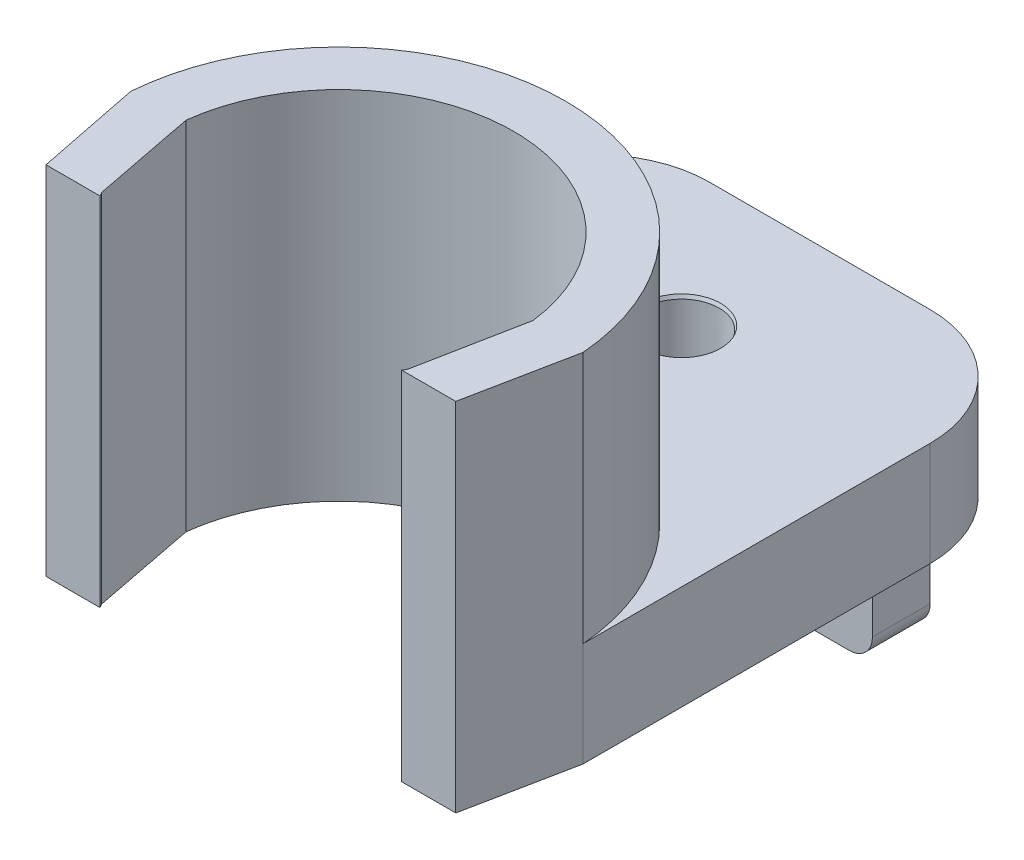
ISO-10303-21;
HEADER;
FILE_DESCRIPTION(('STEP AP214'),'2;1');
FILE_NAME('part.step','',(''),(''),'','','');
FILE_SCHEMA(('AUTOMOTIVE_DESIGN { 1 0 10303 214 1 1 1 1 }'));
ENDSEC;
DATA;
#1=APPLICATION_CONTEXT('core data for automotive mechanical design processes');
#2=APPLICATION_PROTOCOL_DEFINITION('international standard','automotive_design',2000,#1);
#3=PRODUCT_CONTEXT('',#1,'mechanical');
#4=PRODUCT('Part','Part','',(#3));
#5=PRODUCT_RELATED_PRODUCT_CATEGORY('part','',(#4));
#6=PRODUCT_DEFINITION_FORMATION('','',#4);
#7=PRODUCT_DEFINITION_CONTEXT('part definition',#1,'design');
#8=PRODUCT_DEFINITION('design','',#6,#7);
#9=PRODUCT_DEFINITION_SHAPE('','',#8);
#10=(LENGTH_UNIT() NAMED_UNIT(*) SI_UNIT(.MILLI.,.METRE.));
#11=(NAMED_UNIT(*) PLANE_ANGLE_UNIT() SI_UNIT($,.RADIAN.));
#12=(NAMED_UNIT(*) SI_UNIT($,.STERADIAN.) SOLID_ANGLE_UNIT());
#13=UNCERTAINTY_MEASURE_WITH_UNIT(LENGTH_MEASURE(1.E-05),#10,'distance_accuracy_value','');
#14=(GEOMETRIC_REPRESENTATION_CONTEXT(3) GLOBAL_UNCERTAINTY_ASSIGNED_CONTEXT((#13)) GLOBAL_UNIT_ASSIGNED_CONTEXT((#10,
#11,#12)) REPRESENTATION_CONTEXT('',''));
#15=CARTESIAN_POINT('',(0.,0.,0.));
#16=DIRECTION('',(0.,0.,1.));
#17=DIRECTION('',(1.,0.,0.));
#18=AXIS2_PLACEMENT_3D('',#15,#16,#17);
#19=CARTESIAN_POINT('',(0.,318.77,0.));
#20=DIRECTION('',(0.,-1.,0.));
#21=DIRECTION('',(0.,0.,-1.));
#22=AXIS2_PLACEMENT_3D('',#19,#20,#21);
#23=PLANE('',#22);
#24=CARTESIAN_POINT('',(0.,318.77,0.));
#25=DIRECTION('',(0.,-1.,0.));
#26=DIRECTION('',(0.,0.,-1.));
#27=AXIS2_PLACEMENT_3D('',#24,#25,#26);
#28=CIRCLE('',#27,15.095);
#29=CARTESIAN_POINT('',(-13.0345056041586,318.77,7.61319175216006));
#30=VERTEX_POINT('',#29);
#31=CARTESIAN_POINT('',(-13.2274270159691,318.77,7.27283985367548));
#32=VERTEX_POINT('',#31);
#33=EDGE_CURVE('E333',#30,#32,#28,.T.);
#34=ORIENTED_EDGE('',*,*,#33,.F.);
#35=DIRECTION('',(1.,0.,0.));
#36=VECTOR('',#35,1.);
#37=CARTESIAN_POINT('',(0.,318.77,7.61319175216006));
#38=LINE('',#37,#36);
#39=CARTESIAN_POINT('',(-17.7,318.77,7.61319175216006));
#40=VERTEX_POINT('',#39);
#41=EDGE_CURVE('E340',#40,#30,#38,.T.);
#42=ORIENTED_EDGE('',*,*,#41,.F.);
#43=DIRECTION('',(0.1962928408343,0.,0.980545317992595));
#44=VECTOR('',#43,1.);
#45=CARTESIAN_POINT('',(-17.7,318.77,7.61319175216006));
#46=LINE('',#45,#44);
#47=CARTESIAN_POINT('',(-19.5338143213269,318.77,-1.54729540163647));
#48=VERTEX_POINT('',#47);
#49=EDGE_CURVE('E221',#48,#40,#46,.T.);
#50=ORIENTED_EDGE('',*,*,#49,.F.);
#51=DIRECTION('',(0.,0.,-1.));
#52=VECTOR('',#51,1.);
#53=CARTESIAN_POINT('',(-19.5338143213269,318.77,0.));
#54=LINE('',#53,#52);
#55=CARTESIAN_POINT('',(-19.5338143213269,318.77,-31.5472954016365));
#56=VERTEX_POINT('',#55);
#57=EDGE_CURVE('E362',#48,#56,#54,.T.);
#58=ORIENTED_EDGE('',*,*,#57,.T.);
#59=CARTESIAN_POINT('',(-9.53381432132687,318.77,-31.5472954016365));
#60=DIRECTION('',(0.,-1.,0.));
#61=DIRECTION('',(0.,0.,-1.));
#62=AXIS2_PLACEMENT_3D('',#59,#60,#61);
#63=CIRCLE('',#62,10.);
#64=CARTESIAN_POINT('',(-11.7669071606634,318.77,-41.2947718120159));
#65=VERTEX_POINT('',#64);
#66=EDGE_CURVE('E242',#56,#65,#63,.T.);
#67=ORIENTED_EDGE('',*,*,#66,.T.);
#68=DIRECTION('',(0.,0.,1.));
#69=VECTOR('',#68,1.);
#70=CARTESIAN_POINT('',(-11.7669071606634,318.77,-36.5472954016365));
#71=LINE('',#70,#69);
#72=CARTESIAN_POINT('',(-11.7669071606634,318.77,-36.5472954016365));
#73=VERTEX_POINT('',#72);
#74=EDGE_CURVE('E259',#65,#73,#71,.T.);
#75=ORIENTED_EDGE('',*,*,#74,.T.);
#76=DIRECTION('',(-1.,0.,0.));
#77=VECTOR('',#76,1.);
#78=CARTESIAN_POINT('',(0.,318.77,-36.5472954016365));
#79=LINE('',#78,#77);
#80=CARTESIAN_POINT('',(11.5338143213269,318.77,-36.5472954016365));
#81=VERTEX_POINT('',#80);
#82=EDGE_CURVE('E392',#81,#73,#79,.T.);
#83=ORIENTED_EDGE('',*,*,#82,.F.);
#84=DIRECTION('',(0.,0.,1.));
#85=VECTOR('',#84,1.);
#86=CARTESIAN_POINT('',(11.5338143213269,318.77,0.));
#87=LINE('',#86,#85);
#88=CARTESIAN_POINT('',(11.5338143213269,318.77,-41.3452543727692));
#89=VERTEX_POINT('',#88);
#90=EDGE_CURVE('E262',#81,#89,#87,.F.);
#91=ORIENTED_EDGE('',*,*,#90,.T.);
#92=CARTESIAN_POINT('',(9.53381432132687,318.77,-31.5472954016365));
#93=DIRECTION('',(0.,-1.,0.));
#94=DIRECTION('',(0.,0.,-1.));
#95=AXIS2_PLACEMENT_3D('',#92,#93,#94);
#96=CIRCLE('',#95,10.);
#97=CARTESIAN_POINT('',(19.5338143213269,318.77,-31.5472954016365));
#98=VERTEX_POINT('',#97);
#99=EDGE_CURVE('E226',#89,#98,#96,.T.);
#100=ORIENTED_EDGE('',*,*,#99,.T.);
#101=DIRECTION('',(0.,0.,-1.));
#102=VECTOR('',#101,1.);
#103=CARTESIAN_POINT('',(19.5338143213269,318.77,0.));
#104=LINE('',#103,#102);
#105=CARTESIAN_POINT('',(19.5338143213269,318.77,-1.54729540163646));
#106=VERTEX_POINT('',#105);
#107=EDGE_CURVE('E347',#106,#98,#104,.T.);
#108=ORIENTED_EDGE('',*,*,#107,.F.);
#109=DIRECTION('',(0.1962928408343,0.,-0.980545317992596));
#110=VECTOR('',#109,1.);
#111=CARTESIAN_POINT('',(19.5338143213269,318.77,-1.54729540163646));
#112=LINE('',#111,#110);
#113=CARTESIAN_POINT('',(17.7,318.77,7.61319175216007));
#114=VERTEX_POINT('',#113);
#115=EDGE_CURVE('E339',#114,#106,#112,.T.);
#116=ORIENTED_EDGE('',*,*,#115,.F.);
#117=CARTESIAN_POINT('',(13.0345056041586,318.77,7.61319175216007));
#118=VERTEX_POINT('',#117);
#119=EDGE_CURVE('E322',#118,#114,#38,.T.);
#120=ORIENTED_EDGE('',*,*,#119,.F.);
#121=CARTESIAN_POINT('',(0.,318.77,0.));
#122=DIRECTION('',(0.,-1.,0.));
#123=DIRECTION('',(0.,0.,-1.));
#124=AXIS2_PLACEMENT_3D('',#121,#122,#123);
#125=CIRCLE('',#124,15.095);
#126=CARTESIAN_POINT('',(13.2274270159691,318.77,7.27283985367547));
#127=VERTEX_POINT('',#126);
#128=EDGE_CURVE('E327',#127,#118,#125,.T.);
#129=ORIENTED_EDGE('',*,*,#128,.F.);
#130=DIRECTION('',(0.191180053095286,0.,-0.981554984348041));
#131=VECTOR('',#130,1.);
#132=CARTESIAN_POINT('',(14.1087425915103,318.77,2.74799700553123));
#133=LINE('',#132,#131);
#134=CARTESIAN_POINT('',(14.9900581670516,318.77,-1.77684584261301));
#135=VERTEX_POINT('',#134);
#136=EDGE_CURVE('E332',#127,#135,#133,.T.);
#137=ORIENTED_EDGE('',*,*,#136,.T.);
#138=CARTESIAN_POINT('',(0.,318.77,0.));
#139=DIRECTION('',(0.,-1.,0.));
#140=DIRECTION('',(0.,0.,-1.));
#141=AXIS2_PLACEMENT_3D('',#138,#139,#140);
#142=CIRCLE('',#141,15.095);
#143=CARTESIAN_POINT('',(-14.9900581670516,318.77,-1.77684584261301));
#144=VERTEX_POINT('',#143);
#145=EDGE_CURVE('E401',#144,#135,#142,.T.);
#146=ORIENTED_EDGE('',*,*,#145,.F.);
#147=DIRECTION('',(-0.191180053095286,0.,-0.981554984348041));
#148=VECTOR('',#147,1.);
#149=CARTESIAN_POINT('',(-14.1087425915103,318.77,2.74799700553123));
#150=LINE('',#149,#148);
#151=EDGE_CURVE('E395',#32,#144,#150,.T.);
#152=ORIENTED_EDGE('',*,*,#151,.F.);
#153=EDGE_LOOP('',(#34,#42,#50,#58,#67,#75,#83,#91,#100,#108,#116,#120,#129,#137,#146,#152));
#154=FACE_BOUND('',#153,.T.);
#155=CARTESIAN_POINT('',(0.,318.77,-29.595));
#156=DIRECTION('',(0.,-1.,0.));
#157=DIRECTION('',(0.,0.,-1.));
#158=AXIS2_PLACEMENT_3D('',#155,#156,#157);
#159=CIRCLE('',#158,3.25);
#160=CARTESIAN_POINT('',(0.,318.77,-32.845));
#161=VERTEX_POINT('',#160);
#162=EDGE_CURVE('E367',#161,#161,#159,.T.);
#163=ORIENTED_EDGE('',*,*,#162,.F.);
#164=EDGE_LOOP('',(#163));
#165=FACE_BOUND('',#164,.T.);
#166=ADVANCED_FACE('F45',(#154,#165),#23,.T.);
#167=CARTESIAN_POINT('',(0.,318.77,0.));
#168=DIRECTION('',(0.,1.,0.));
#169=DIRECTION('',(0.,0.,1.));
#170=AXIS2_PLACEMENT_3D('',#167,#168,#169);
#171=CYLINDRICAL_SURFACE('',#170,19.595);
#172=CARTESIAN_POINT('',(0.,349.57,0.));
#173=DIRECTION('',(0.,-1.,0.));
#174=DIRECTION('',(0.,0.,-1.));
#175=AXIS2_PLACEMENT_3D('',#172,#173,#174);
#176=CIRCLE('',#175,19.595);
#177=CARTESIAN_POINT('',(19.5338143213269,349.57,-1.54729540163646));
#178=VERTEX_POINT('',#177);
#179=CARTESIAN_POINT('',(-19.5338143213269,349.57,-1.54729540163647));
#180=VERTEX_POINT('',#179);
#181=EDGE_CURVE('E202',#178,#180,#176,.F.);
#182=ORIENTED_EDGE('',*,*,#181,.F.);
#183=DIRECTION('',(0.,1.,0.));
#184=VECTOR('',#183,1.);
#185=CARTESIAN_POINT('',(19.5338143213269,318.77,-1.54729540163646));
#186=LINE('',#185,#184);
#187=CARTESIAN_POINT('',(19.5338143213269,327.77,-1.54729540163646));
#188=VERTEX_POINT('',#187);
#189=EDGE_CURVE('E237',#188,#178,#186,.T.);
#190=ORIENTED_EDGE('',*,*,#189,.F.);
#191=CARTESIAN_POINT('',(0.,327.77,0.));
#192=DIRECTION('',(0.,-1.,0.));
#193=DIRECTION('',(0.,0.,-1.));
#194=AXIS2_PLACEMENT_3D('',#191,#192,#193);
#195=CIRCLE('',#194,19.595);
#196=CARTESIAN_POINT('',(-19.5338143213269,327.77,-1.54729540163647));
#197=VERTEX_POINT('',#196);
#198=EDGE_CURVE('E341',#197,#188,#195,.T.);
#199=ORIENTED_EDGE('',*,*,#198,.F.);
#200=DIRECTION('',(0.,1.,0.));
#201=VECTOR('',#200,1.);
#202=CARTESIAN_POINT('',(-19.5338143213269,318.77,-1.54729540163647));
#203=LINE('',#202,#201);
#204=EDGE_CURVE('E229',#197,#180,#203,.T.);
#205=ORIENTED_EDGE('',*,*,#204,.T.);
#206=EDGE_LOOP('',(#182,#190,#199,#205));
#207=FACE_BOUND('',#206,.T.);
#208=ADVANCED_FACE('F427',(#207),#171,.T.);
#209=CARTESIAN_POINT('',(-17.7,318.77,7.61319175216006));
#210=DIRECTION('',(-0.980545317992595,0.,0.1962928408343));
#211=DIRECTION('',(0.1962928408343,0.,0.980545317992595));
#212=AXIS2_PLACEMENT_3D('',#209,#210,#211);
#213=PLANE('',#212);
#214=DIRECTION('',(0.1962928408343,0.,0.980545317992595));
#215=VECTOR('',#214,1.);
#216=CARTESIAN_POINT('',(-17.7,349.57,7.61319175216006));
#217=LINE('',#216,#215);
#218=CARTESIAN_POINT('',(-17.7,349.57,7.61319175216006));
#219=VERTEX_POINT('',#218);
#220=EDGE_CURVE('E196',#180,#219,#217,.T.);
#221=ORIENTED_EDGE('',*,*,#220,.F.);
#222=ORIENTED_EDGE('',*,*,#204,.F.);
#223=EDGE_CURVE('E223',#48,#197,#203,.T.);
#224=ORIENTED_EDGE('',*,*,#223,.F.);
#225=ORIENTED_EDGE('',*,*,#49,.T.);
#226=DIRECTION('',(0.,1.,0.));
#227=VECTOR('',#226,1.);
#228=CARTESIAN_POINT('',(-17.7,318.77,7.61319175216006));
#229=LINE('',#228,#227);
#230=EDGE_CURVE('E213',#40,#219,#229,.T.);
#231=ORIENTED_EDGE('',*,*,#230,.T.);
#232=EDGE_LOOP('',(#221,#222,#224,#225,#231));
#233=FACE_BOUND('',#232,.T.);
#234=ADVANCED_FACE('F219',(#233),#213,.T.);
#235=CARTESIAN_POINT('',(19.5338143213269,318.77,-1.54729540163646));
#236=DIRECTION('',(0.980545317992595,0.,0.1962928408343));
#237=DIRECTION('',(0.1962928408343,0.,-0.980545317992595));
#238=AXIS2_PLACEMENT_3D('',#235,#236,#237);
#239=PLANE('',#238);
#240=DIRECTION('',(0.1962928408343,0.,-0.980545317992595));
#241=VECTOR('',#240,1.);
#242=CARTESIAN_POINT('',(19.5338143213269,349.57,-1.54729540163646));
#243=LINE('',#242,#241);
#244=CARTESIAN_POINT('',(17.7,349.57,7.61319175216006));
#245=VERTEX_POINT('',#244);
#246=EDGE_CURVE('E416',#245,#178,#243,.T.);
#247=ORIENTED_EDGE('',*,*,#246,.F.);
#248=DIRECTION('',(0.,1.,0.));
#249=VECTOR('',#248,1.);
#250=CARTESIAN_POINT('',(17.7,318.77,7.61319175216007));
#251=LINE('',#250,#249);
#252=EDGE_CURVE('E238',#114,#245,#251,.T.);
#253=ORIENTED_EDGE('',*,*,#252,.F.);
#254=ORIENTED_EDGE('',*,*,#115,.T.);
#255=EDGE_CURVE('E234',#106,#188,#186,.T.);
#256=ORIENTED_EDGE('',*,*,#255,.T.);
#257=ORIENTED_EDGE('',*,*,#189,.T.);
#258=EDGE_LOOP('',(#247,#253,#254,#256,#257));
#259=FACE_BOUND('',#258,.T.);
#260=ADVANCED_FACE('F352',(#259),#239,.T.);
#261=CARTESIAN_POINT('',(-17.7,309.57,7.61319175216006));
#262=DIRECTION('',(0.,0.,-1.));
#263=DIRECTION('',(-1.,0.,0.));
#264=AXIS2_PLACEMENT_3D('',#261,#262,#263);
#265=PLANE('',#264);
#266=ORIENTED_EDGE('',*,*,#252,.T.);
#267=DIRECTION('',(1.,0.,0.));
#268=VECTOR('',#267,1.);
#269=CARTESIAN_POINT('',(25.,349.57,7.61319175216006));
#270=LINE('',#269,#268);
#271=CARTESIAN_POINT('',(13.0345056041586,349.57,7.61319175216006));
#272=VERTEX_POINT('',#271);
#273=EDGE_CURVE('E216',#272,#245,#270,.T.);
#274=ORIENTED_EDGE('',*,*,#273,.F.);
#275=DIRECTION('',(0.,1.,0.));
#276=VECTOR('',#275,1.);
#277=CARTESIAN_POINT('',(13.0345056041586,299.57,7.61319175216007));
#278=LINE('',#277,#276);
#279=EDGE_CURVE('E53',#272,#118,#278,.F.);
#280=ORIENTED_EDGE('',*,*,#279,.T.);
#281=ORIENTED_EDGE('',*,*,#119,.T.);
#282=EDGE_LOOP('',(#266,#274,#280,#281));
#283=FACE_BOUND('',#282,.T.);
#284=ADVANCED_FACE('F320',(#283),#265,.F.);
#285=DIRECTION('',(0.,1.,0.));
#286=VECTOR('',#285,1.);
#287=CARTESIAN_POINT('',(-13.0345056041586,299.57,7.61319175216006));
#288=LINE('',#287,#286);
#289=CARTESIAN_POINT('',(-13.0345056041586,349.57,7.61319175216006));
#290=VERTEX_POINT('',#289);
#291=EDGE_CURVE('E215',#30,#290,#288,.T.);
#292=ORIENTED_EDGE('',*,*,#291,.T.);
#293=EDGE_CURVE('E199',#219,#290,#270,.T.);
#294=ORIENTED_EDGE('',*,*,#293,.F.);
#295=ORIENTED_EDGE('',*,*,#230,.F.);
#296=ORIENTED_EDGE('',*,*,#41,.T.);
#297=EDGE_LOOP('',(#292,#294,#295,#296));
#298=FACE_BOUND('',#297,.T.);
#299=ADVANCED_FACE('F211',(#298),#265,.F.);
#300=CARTESIAN_POINT('',(-19.5338143213269,327.77,0.));
#301=DIRECTION('',(-1.,0.,0.));
#302=DIRECTION('',(0.,0.,1.));
#303=AXIS2_PLACEMENT_3D('',#300,#301,#302);
#304=PLANE('',#303);
#305=DIRECTION('',(0.,0.,-1.));
#306=VECTOR('',#305,1.);
#307=CARTESIAN_POINT('',(-19.5338143213269,327.77,0.));
#308=LINE('',#307,#306);
#309=CARTESIAN_POINT('',(-19.5338143213269,327.77,-31.5472954016365));
#310=VERTEX_POINT('',#309);
#311=EDGE_CURVE('E361',#197,#310,#308,.T.);
#312=ORIENTED_EDGE('',*,*,#311,.T.);
#313=DIRECTION('',(0.,-1.,0.));
#314=VECTOR('',#313,1.);
#315=CARTESIAN_POINT('',(-19.5338143213269,327.77,-31.5472954016365));
#316=LINE('',#315,#314);
#317=EDGE_CURVE('E222',#310,#56,#316,.T.);
#318=ORIENTED_EDGE('',*,*,#317,.T.);
#319=ORIENTED_EDGE('',*,*,#57,.F.);
#320=ORIENTED_EDGE('',*,*,#223,.T.);
#321=EDGE_LOOP('',(#312,#318,#319,#320));
#322=FACE_BOUND('',#321,.T.);
#323=ADVANCED_FACE('F430',(#322),#304,.T.);
#324=CARTESIAN_POINT('',(19.5338143213269,327.77,0.));
#325=DIRECTION('',(-1.,0.,0.));
#326=DIRECTION('',(0.,0.,1.));
#327=AXIS2_PLACEMENT_3D('',#324,#325,#326);
#328=PLANE('',#327);
#329=ORIENTED_EDGE('',*,*,#107,.T.);
#330=DIRECTION('',(0.,-1.,0.));
#331=VECTOR('',#330,1.);
#332=CARTESIAN_POINT('',(19.5338143213269,327.77,-31.5472954016365));
#333=LINE('',#332,#331);
#334=CARTESIAN_POINT('',(19.5338143213269,327.77,-31.5472954016365));
#335=VERTEX_POINT('',#334);
#336=EDGE_CURVE('E252',#98,#335,#333,.F.);
#337=ORIENTED_EDGE('',*,*,#336,.T.);
#338=DIRECTION('',(0.,0.,-1.));
#339=VECTOR('',#338,1.);
#340=CARTESIAN_POINT('',(19.5338143213269,327.77,0.));
#341=LINE('',#340,#339);
#342=EDGE_CURVE('E344',#188,#335,#341,.T.);
#343=ORIENTED_EDGE('',*,*,#342,.F.);
#344=ORIENTED_EDGE('',*,*,#255,.F.);
#345=EDGE_LOOP('',(#329,#337,#343,#344));
#346=FACE_BOUND('',#345,.T.);
#347=ADVANCED_FACE('F357',(#346),#328,.F.);
#348=CARTESIAN_POINT('',(0.,327.77,-41.5472954016365));
#349=DIRECTION('',(0.,0.,-1.));
#350=DIRECTION('',(-1.,0.,0.));
#351=AXIS2_PLACEMENT_3D('',#348,#349,#350);
#352=PLANE('',#351);
#353=DIRECTION('',(1.,0.,0.));
#354=VECTOR('',#353,1.);
#355=CARTESIAN_POINT('',(0.,303.77,-41.5472954016365));
#356=LINE('',#355,#354);
#357=CARTESIAN_POINT('',(-7.76690716066343,303.77,-41.5472954016365));
#358=VERTEX_POINT('',#357);
#359=CARTESIAN_POINT('',(7.53381432132687,303.77,-41.5472954016365));
#360=VERTEX_POINT('',#359);
#361=EDGE_CURVE('E394',#358,#360,#356,.T.);
#362=ORIENTED_EDGE('',*,*,#361,.F.);
#363=CARTESIAN_POINT('',(-7.76690716066343,305.77,-41.5472954016365));
#364=DIRECTION('',(0.,0.,-1.));
#365=DIRECTION('',(-1.,0.,0.));
#366=AXIS2_PLACEMENT_3D('',#363,#364,#365);
#367=CIRCLE('',#366,2.);
#368=CARTESIAN_POINT('',(-9.53381432132687,304.832962601816,-41.5472954016365));
#369=VERTEX_POINT('',#368);
#370=EDGE_CURVE('E280',#358,#369,#367,.T.);
#371=ORIENTED_EDGE('',*,*,#370,.T.);
#372=DIRECTION('',(0.,-1.,0.));
#373=VECTOR('',#372,1.);
#374=CARTESIAN_POINT('',(-9.53381432132687,327.77,-41.5472954016365));
#375=LINE('',#374,#373);
#376=CARTESIAN_POINT('',(-9.53381432132687,327.77,-41.5472954016365));
#377=VERTEX_POINT('',#376);
#378=EDGE_CURVE('E246',#369,#377,#375,.F.);
#379=ORIENTED_EDGE('',*,*,#378,.T.);
#380=DIRECTION('',(1.,0.,0.));
#381=VECTOR('',#380,1.);
#382=CARTESIAN_POINT('',(0.,327.77,-41.5472954016365));
#383=LINE('',#382,#381);
#384=CARTESIAN_POINT('',(9.53381432132687,327.77,-41.5472954016365));
#385=VERTEX_POINT('',#384);
#386=EDGE_CURVE('E364',#377,#385,#383,.T.);
#387=ORIENTED_EDGE('',*,*,#386,.T.);
#388=DIRECTION('',(0.,-1.,0.));
#389=VECTOR('',#388,1.);
#390=CARTESIAN_POINT('',(9.53381432132687,318.77,-41.5472954016365));
#391=LINE('',#390,#389);
#392=CARTESIAN_POINT('',(9.53381432132687,316.77,-41.5472954016365));
#393=VERTEX_POINT('',#392);
#394=EDGE_CURVE('E67',#385,#393,#391,.T.);
#395=ORIENTED_EDGE('',*,*,#394,.T.);
#396=DIRECTION('',(0.,1.,0.));
#397=VECTOR('',#396,1.);
#398=CARTESIAN_POINT('',(9.53381432132687,303.77,-41.5472954016365));
#399=LINE('',#398,#397);
#400=CARTESIAN_POINT('',(9.53381432132687,305.77,-41.5472954016365));
#401=VERTEX_POINT('',#400);
#402=EDGE_CURVE('E380',#401,#393,#399,.T.);
#403=ORIENTED_EDGE('',*,*,#402,.F.);
#404=CARTESIAN_POINT('',(7.53381432132687,305.77,-41.5472954016365));
#405=DIRECTION('',(0.,0.,-1.));
#406=DIRECTION('',(-1.,0.,0.));
#407=AXIS2_PLACEMENT_3D('',#404,#405,#406);
#408=CIRCLE('',#407,2.);
#409=EDGE_CURVE('E278',#401,#360,#408,.T.);
#410=ORIENTED_EDGE('',*,*,#409,.T.);
#411=EDGE_LOOP('',(#362,#371,#379,#387,#395,#403,#410));
#412=FACE_BOUND('',#411,.T.);
#413=ADVANCED_FACE('F494',(#412),#352,.T.);
#414=CARTESIAN_POINT('',(0.,327.77,0.));
#415=DIRECTION('',(0.,-1.,0.));
#416=DIRECTION('',(0.,0.,-1.));
#417=AXIS2_PLACEMENT_3D('',#414,#415,#416);
#418=PLANE('',#417);
#419=CARTESIAN_POINT('',(0.,327.77,-29.595));
#420=DIRECTION('',(0.,1.,0.));
#421=DIRECTION('',(0.,0.,1.));
#422=AXIS2_PLACEMENT_3D('',#419,#420,#421);
#423=CIRCLE('',#422,3.375);
#424=CARTESIAN_POINT('',(0.,327.77,-26.22));
#425=VERTEX_POINT('',#424);
#426=EDGE_CURVE('E377',#425,#425,#423,.T.);
#427=ORIENTED_EDGE('',*,*,#426,.F.);
#428=EDGE_LOOP('',(#427));
#429=FACE_BOUND('',#428,.T.);
#430=ORIENTED_EDGE('',*,*,#386,.F.);
#431=CARTESIAN_POINT('',(-9.53381432132687,327.77,-31.5472954016365));
#432=DIRECTION('',(0.,-1.,0.));
#433=DIRECTION('',(0.,0.,-1.));
#434=AXIS2_PLACEMENT_3D('',#431,#432,#433);
#435=CIRCLE('',#434,10.);
#436=EDGE_CURVE('E250',#377,#310,#435,.F.);
#437=ORIENTED_EDGE('',*,*,#436,.T.);
#438=ORIENTED_EDGE('',*,*,#311,.F.);
#439=ORIENTED_EDGE('',*,*,#198,.T.);
#440=ORIENTED_EDGE('',*,*,#342,.T.);
#441=CARTESIAN_POINT('',(9.53381432132687,327.77,-31.5472954016365));
#442=DIRECTION('',(0.,-1.,0.));
#443=DIRECTION('',(0.,0.,-1.));
#444=AXIS2_PLACEMENT_3D('',#441,#442,#443);
#445=CIRCLE('',#444,10.);
#446=EDGE_CURVE('E248',#335,#385,#445,.F.);
#447=ORIENTED_EDGE('',*,*,#446,.T.);
#448=EDGE_LOOP('',(#430,#437,#438,#439,#440,#447));
#449=FACE_BOUND('',#448,.T.);
#450=ADVANCED_FACE('F434',(#429,#449),#418,.F.);
#451=CARTESIAN_POINT('',(0.,327.77,-29.595));
#452=DIRECTION('',(0.,1.,0.));
#453=DIRECTION('',(0.,0.,1.));
#454=AXIS2_PLACEMENT_3D('',#451,#452,#453);
#455=CYLINDRICAL_SURFACE('',#454,3.25);
#456=CARTESIAN_POINT('',(0.,327.468223304703,-29.595));
#457=DIRECTION('',(0.,1.,0.));
#458=DIRECTION('',(0.,0.,1.));
#459=AXIS2_PLACEMENT_3D('',#456,#457,#458);
#460=CIRCLE('',#459,3.25);
#461=CARTESIAN_POINT('',(0.,327.468223304703,-26.345));
#462=VERTEX_POINT('',#461);
#463=EDGE_CURVE('E370',#462,#462,#460,.T.);
#464=ORIENTED_EDGE('',*,*,#463,.T.);
#465=EDGE_LOOP('',(#464));
#466=FACE_BOUND('',#465,.T.);
#467=ORIENTED_EDGE('',*,*,#162,.T.);
#468=EDGE_LOOP('',(#467));
#469=FACE_BOUND('',#468,.T.);
#470=ADVANCED_FACE('F501',(#466,#469),#455,.F.);
#471=CARTESIAN_POINT('',(0.,327.77,-29.595));
#472=DIRECTION('',(0.,1.,0.));
#473=DIRECTION('',(0.,0.,1.));
#474=AXIS2_PLACEMENT_3D('',#471,#472,#473);
#475=CONICAL_SURFACE('',#474,3.375,0.392699081698733);
#476=ORIENTED_EDGE('',*,*,#463,.F.);
#477=EDGE_LOOP('',(#476));
#478=FACE_BOUND('',#477,.T.);
#479=ORIENTED_EDGE('',*,*,#426,.T.);
#480=EDGE_LOOP('',(#479));
#481=FACE_BOUND('',#480,.T.);
#482=ADVANCED_FACE('F466',(#478,#481),#475,.F.);
#483=CARTESIAN_POINT('',(-9.53381432132687,327.77,-31.5472954016365));
#484=DIRECTION('',(0.,-1.,0.));
#485=DIRECTION('',(0.,0.,-1.));
#486=AXIS2_PLACEMENT_3D('',#483,#484,#485);
#487=CYLINDRICAL_SURFACE('',#486,10.);
#488=ORIENTED_EDGE('',*,*,#378,.F.);
#489=CARTESIAN_POINT('',(-9.53381432132687,304.832962601816,-41.5472954016365));
#490=CARTESIAN_POINT('',(-9.56042551823967,304.883127858395,-41.5472929579181));
#491=CARTESIAN_POINT('',(-9.58488880831034,304.93443173061,-41.5471890358423));
#492=CARTESIAN_POINT('',(-9.62937571490766,305.038952073037,-41.5468642086717));
#493=CARTESIAN_POINT('',(-9.64939766627155,305.092169251931,-41.5466432598056));
#494=CARTESIAN_POINT('',(-9.68448222218,305.199030160799,-41.5461752280064));
#495=CARTESIAN_POINT('',(-9.69963630092735,305.252643890637,-41.5459287586258));
#496=CARTESIAN_POINT('',(-9.72541463847834,305.360923390073,-41.5454680221845));
#497=CARTESIAN_POINT('',(-9.73604113153452,305.415588626826,-41.5452537392744));
#498=CARTESIAN_POINT('',(-9.7518340593349,305.519898255309,-41.5449214017015));
#499=CARTESIAN_POINT('',(-9.75745282124989,305.569474691895,-41.5447956662496));
#500=CARTESIAN_POINT('',(-9.76500820880981,305.669364709529,-41.5446226505739));
#501=CARTESIAN_POINT('',(-9.76691060753065,305.719680881851,-41.5445761001282));
#502=CARTESIAN_POINT('',(-9.76690716066343,305.77,-41.5445784189492));
#503=B_SPLINE_CURVE_WITH_KNOTS('',3,(#489,#490,#491,#492,#493,#494,#495,#496,#497,#498,#499,
#500,#501,#502),.UNSPECIFIED.,.F.,.F.,(4,2,2,2,2,2,4),(0.,0.17030758531962,0.340678915456088,
0.507630685866859,0.67449997398182,0.824044761607944,0.974960450579539),.UNSPECIFIED.);
#504=CARTESIAN_POINT('',(-9.76690716066343,305.77,-41.5445784189492));
#505=VERTEX_POINT('',#504);
#506=EDGE_CURVE('E282',#369,#505,#503,.T.);
#507=ORIENTED_EDGE('',*,*,#506,.T.);
#508=DIRECTION('',(0.,1.,0.));
#509=VECTOR('',#508,1.);
#510=CARTESIAN_POINT('',(-9.76690716066343,303.77,-41.5445784189492));
#511=LINE('',#510,#509);
#512=CARTESIAN_POINT('',(-9.76690716066343,316.77,-41.5445784189492));
#513=VERTEX_POINT('',#512);
#514=EDGE_CURVE('E388',#505,#513,#511,.T.);
#515=ORIENTED_EDGE('',*,*,#514,.T.);
#516=CARTESIAN_POINT('',(-9.76690716066343,316.77,-41.5445784189492));
#517=CARTESIAN_POINT('',(-9.76690753704446,316.826207739626,-41.5445756845839));
#518=CARTESIAN_POINT('',(-9.76927813398007,316.882388584646,-41.5445234453085));
#519=CARTESIAN_POINT('',(-9.77873542948893,316.994349174416,-41.5442972839632));
#520=CARTESIAN_POINT('',(-9.78582192675048,317.050128936186,-41.5441233670875));
#521=CARTESIAN_POINT('',(-9.81408985175402,317.216181267396,-41.5433858505241));
#522=CARTESIAN_POINT('',(-9.84227988652494,317.325343108553,-41.5426066161938));
#523=CARTESIAN_POINT('',(-9.91656533818463,317.537384505502,-41.5400361086555));
#524=CARTESIAN_POINT('',(-9.96267005721857,317.640260765355,-41.5382443094562));
#525=CARTESIAN_POINT('',(-10.0714539948191,317.836790607899,-41.5329800097009));
#526=CARTESIAN_POINT('',(-10.1341301417357,317.93044589536,-41.5295078205199));
#527=CARTESIAN_POINT('',(-10.2740710008998,318.10565953209,-41.5201040416591));
#528=CARTESIAN_POINT('',(-10.3513038067362,318.187243654581,-41.5141777975837));
#529=CARTESIAN_POINT('',(-10.5181460559143,318.336237873972,-41.4990836513585));
#530=CARTESIAN_POINT('',(-10.6077557104427,318.403647728966,-41.4899156938909));
#531=CARTESIAN_POINT('',(-10.7960180339919,318.52204681628,-41.4677671779222));
#532=CARTESIAN_POINT('',(-10.8946115083521,318.573134779067,-41.4548104875107));
#533=CARTESIAN_POINT('',(-11.0983312884642,318.658167829971,-41.424687117531));
#534=CARTESIAN_POINT('',(-11.2034560700129,318.69211690102,-41.4075214174794));
#535=CARTESIAN_POINT('',(-11.3854423043819,318.734806621094,-41.374671608599));
#536=CARTESIAN_POINT('',(-11.4614798266458,318.748031342914,-41.3600476361846));
#537=CARTESIAN_POINT('',(-11.6140460428911,318.765628390394,-41.3288474314818));
#538=CARTESIAN_POINT('',(-11.6905737238264,318.77001523425,-41.3122744483695));
#539=CARTESIAN_POINT('',(-11.7669071606634,318.77,-41.2947718120159));
#540=B_SPLINE_CURVE_WITH_KNOTS('',3,(#516,#517,#518,#519,#520,#521,#522,#523,#524,#525,#526,
#527,#528,#529,#530,#531,#532,#533,#534,#535,#536,#537,#538,#539),.UNSPECIFIED.,.F.,.F.,(4,2,2,
2,2,2,2,2,2,2,2,4),(0.,0.168519779912596,0.337032366537702,0.673535581435803,1.01021375859866,
1.34682957339999,1.68271597186344,2.01860810227597,2.35242817805012,2.6861706411447,
2.92132945145261,3.15610164466803),.UNSPECIFIED.);
#541=EDGE_CURVE('E308',#513,#65,#540,.T.);
#542=ORIENTED_EDGE('',*,*,#541,.T.);
#543=ORIENTED_EDGE('',*,*,#66,.F.);
#544=ORIENTED_EDGE('',*,*,#317,.F.);
#545=ORIENTED_EDGE('',*,*,#436,.F.);
#546=EDGE_LOOP('',(#488,#507,#515,#542,#543,#544,#545));
#547=FACE_BOUND('',#546,.T.);
#548=ADVANCED_FACE('F291',(#547),#487,.T.);
#549=CARTESIAN_POINT('',(9.53381432132687,327.77,-31.5472954016365));
#550=DIRECTION('',(0.,1.,0.));
#551=DIRECTION('',(0.,0.,1.));
#552=AXIS2_PLACEMENT_3D('',#549,#550,#551);
#553=CYLINDRICAL_SURFACE('',#552,10.);
#554=ORIENTED_EDGE('',*,*,#446,.F.);
#555=ORIENTED_EDGE('',*,*,#336,.F.);
#556=ORIENTED_EDGE('',*,*,#99,.F.);
#557=CARTESIAN_POINT('',(11.5338143213269,318.77,-41.3452543727692));
#558=CARTESIAN_POINT('',(11.4787869564066,318.769999653392,-41.356489283858));
#559=CARTESIAN_POINT('',(11.4236869996809,318.767727307437,-41.3672504964301));
#560=CARTESIAN_POINT('',(11.3136769215847,318.758615027905,-41.3877839179117));
#561=CARTESIAN_POINT('',(11.2587668156482,318.751774731362,-41.3975560481587));
#562=CARTESIAN_POINT('',(11.0949878980105,318.724392284707,-41.425298274568));
#563=CARTESIAN_POINT('',(10.9869167039702,318.696988688377,-41.441725452414));
#564=CARTESIAN_POINT('',(10.7762752920647,318.624339793128,-41.4703812974654));
#565=CARTESIAN_POINT('',(10.6737112882155,318.579074801807,-41.4826053026912));
#566=CARTESIAN_POINT('',(10.4773180747201,318.471857725121,-41.5031755463527));
#567=CARTESIAN_POINT('',(10.3834855440694,318.40991201944,-41.5115232639896));
#568=CARTESIAN_POINT('',(10.2082982422196,318.271774388562,-41.5249067604553));
#569=CARTESIAN_POINT('',(10.1268244971309,318.195736371635,-41.5299758880647));
#570=CARTESIAN_POINT('',(9.97755188654756,318.031108627546,-41.5377256927374));
#571=CARTESIAN_POINT('',(9.90975675980795,317.942515479945,-41.5404057174733));
#572=CARTESIAN_POINT('',(9.78953659322185,317.754871288402,-41.5442075943644));
#573=CARTESIAN_POINT('',(9.73718171505291,317.655775205655,-41.5453224177605));
#574=CARTESIAN_POINT('',(9.64974668059841,317.450253435144,-41.5467194145383));
#575=CARTESIAN_POINT('',(9.61465809604963,317.343831352426,-41.5470019945027));
#576=CARTESIAN_POINT('',(9.57046509906226,317.159107392094,-41.5472450806375));
#577=CARTESIAN_POINT('',(9.55673298012219,317.081879395343,-41.5472764835976));
#578=CARTESIAN_POINT('',(9.53840617148329,316.926444448434,-41.5472954028708));
#579=CARTESIAN_POINT('',(9.53380014866746,316.848238833989,-41.5472829736697));
#580=CARTESIAN_POINT('',(9.53381432132687,316.77,-41.5472954016365));
#581=B_SPLINE_CURVE_WITH_KNOTS('',3,(#557,#558,#559,#560,#561,#562,#563,#564,#565,#566,#567,
#568,#569,#570,#571,#572,#573,#574,#575,#576,#577,#578,#579,#580),.UNSPECIFIED.,.F.,.F.,(4,2,2,
2,2,2,2,2,2,2,2,4),(0.,0.16839082338939,0.336795028538615,0.67313857340185,1.00985398178609,
1.34644079290082,1.67954774299101,2.0127456176982,2.34743503044956,2.68196090748721,
2.91676970044812,3.15128671611921),.UNSPECIFIED.);
#582=EDGE_CURVE('E445',#89,#393,#581,.T.);
#583=ORIENTED_EDGE('',*,*,#582,.T.);
#584=ORIENTED_EDGE('',*,*,#394,.F.);
#585=EDGE_LOOP('',(#554,#555,#556,#583,#584));
#586=FACE_BOUND('',#585,.T.);
#587=ADVANCED_FACE('F455',(#586),#553,.T.);
#588=CARTESIAN_POINT('',(9.53381432132687,303.77,0.));
#589=DIRECTION('',(-1.,0.,0.));
#590=DIRECTION('',(0.,0.,1.));
#591=AXIS2_PLACEMENT_3D('',#588,#589,#590);
#592=PLANE('',#591);
#593=ORIENTED_EDGE('',*,*,#402,.T.);
#594=DIRECTION('',(0.,0.,1.));
#595=VECTOR('',#594,1.);
#596=CARTESIAN_POINT('',(9.53381432132687,316.77,0.));
#597=LINE('',#596,#595);
#598=CARTESIAN_POINT('',(9.53381432132687,316.77,-36.5472954016365));
#599=VERTEX_POINT('',#598);
#600=EDGE_CURVE('E256',#393,#599,#597,.T.);
#601=ORIENTED_EDGE('',*,*,#600,.T.);
#602=DIRECTION('',(0.,1.,0.));
#603=VECTOR('',#602,1.);
#604=CARTESIAN_POINT('',(9.53381432132687,303.77,-36.5472954016365));
#605=LINE('',#604,#603);
#606=CARTESIAN_POINT('',(9.53381432132687,305.77,-36.5472954016365));
#607=VERTEX_POINT('',#606);
#608=EDGE_CURVE('E382',#607,#599,#605,.T.);
#609=ORIENTED_EDGE('',*,*,#608,.F.);
#610=DIRECTION('',(0.,0.,1.));
#611=VECTOR('',#610,1.);
#612=CARTESIAN_POINT('',(9.53381432132687,305.77,-41.5472954016365));
#613=LINE('',#612,#611);
#614=EDGE_CURVE('E254',#607,#401,#613,.F.);
#615=ORIENTED_EDGE('',*,*,#614,.T.);
#616=EDGE_LOOP('',(#593,#601,#609,#615));
#617=FACE_BOUND('',#616,.T.);
#618=ADVANCED_FACE('F458',(#617),#592,.F.);
#619=CARTESIAN_POINT('',(0.,303.77,-36.5472954016365));
#620=DIRECTION('',(0.,0.,-1.));
#621=DIRECTION('',(-1.,0.,0.));
#622=AXIS2_PLACEMENT_3D('',#619,#620,#621);
#623=PLANE('',#622);
#624=DIRECTION('',(0.,1.,0.));
#625=VECTOR('',#624,1.);
#626=CARTESIAN_POINT('',(-9.76690716066343,303.77,-36.5472954016365));
#627=LINE('',#626,#625);
#628=CARTESIAN_POINT('',(-9.76690716066343,305.77,-36.5472954016365));
#629=VERTEX_POINT('',#628);
#630=CARTESIAN_POINT('',(-9.76690716066343,316.77,-36.5472954016365));
#631=VERTEX_POINT('',#630);
#632=EDGE_CURVE('E385',#629,#631,#627,.T.);
#633=ORIENTED_EDGE('',*,*,#632,.F.);
#634=CARTESIAN_POINT('',(-7.76690716066343,305.77,-36.5472954016365));
#635=DIRECTION('',(0.,0.,-1.));
#636=DIRECTION('',(-1.,0.,0.));
#637=AXIS2_PLACEMENT_3D('',#634,#635,#636);
#638=CIRCLE('',#637,2.);
#639=CARTESIAN_POINT('',(-7.76690716066343,303.77,-36.5472954016365));
#640=VERTEX_POINT('',#639);
#641=EDGE_CURVE('E271',#629,#640,#638,.F.);
#642=ORIENTED_EDGE('',*,*,#641,.T.);
#643=DIRECTION('',(-1.,0.,0.));
#644=VECTOR('',#643,1.);
#645=CARTESIAN_POINT('',(0.,303.77,-36.5472954016365));
#646=LINE('',#645,#644);
#647=CARTESIAN_POINT('',(7.53381432132687,303.77,-36.5472954016365));
#648=VERTEX_POINT('',#647);
#649=EDGE_CURVE('E391',#648,#640,#646,.T.);
#650=ORIENTED_EDGE('',*,*,#649,.F.);
#651=CARTESIAN_POINT('',(7.53381432132687,305.77,-36.5472954016365));
#652=DIRECTION('',(0.,0.,-1.));
#653=DIRECTION('',(-1.,0.,0.));
#654=AXIS2_PLACEMENT_3D('',#651,#652,#653);
#655=CIRCLE('',#654,2.);
#656=EDGE_CURVE('E269',#648,#607,#655,.F.);
#657=ORIENTED_EDGE('',*,*,#656,.T.);
#658=ORIENTED_EDGE('',*,*,#608,.T.);
#659=CARTESIAN_POINT('',(11.5338143213269,316.77,-36.5472954016365));
#660=DIRECTION('',(0.,0.,-1.));
#661=DIRECTION('',(-1.,0.,0.));
#662=AXIS2_PLACEMENT_3D('',#659,#660,#661);
#663=CIRCLE('',#662,2.);
#664=EDGE_CURVE('E289',#599,#81,#663,.T.);
#665=ORIENTED_EDGE('',*,*,#664,.T.);
#666=ORIENTED_EDGE('',*,*,#82,.T.);
#667=CARTESIAN_POINT('',(-11.7669071606634,316.77,-36.5472954016365));
#668=DIRECTION('',(0.,0.,-1.));
#669=DIRECTION('',(-1.,0.,0.));
#670=AXIS2_PLACEMENT_3D('',#667,#668,#669);
#671=CIRCLE('',#670,2.);
#672=EDGE_CURVE('E315',#73,#631,#671,.T.);
#673=ORIENTED_EDGE('',*,*,#672,.T.);
#674=EDGE_LOOP('',(#633,#642,#650,#657,#658,#665,#666,#673));
#675=FACE_BOUND('',#674,.T.);
#676=ADVANCED_FACE('F463',(#675),#623,.F.);
#677=CARTESIAN_POINT('',(-9.76690716066345,303.77,0.));
#678=DIRECTION('',(-1.,0.,0.));
#679=DIRECTION('',(0.,0.,1.));
#680=AXIS2_PLACEMENT_3D('',#677,#678,#679);
#681=PLANE('',#680);
#682=ORIENTED_EDGE('',*,*,#632,.T.);
#683=DIRECTION('',(0.,0.,1.));
#684=VECTOR('',#683,1.);
#685=CARTESIAN_POINT('',(-9.76690716066343,316.77,-41.5445784189492));
#686=LINE('',#685,#684);
#687=EDGE_CURVE('E267',#631,#513,#686,.F.);
#688=ORIENTED_EDGE('',*,*,#687,.T.);
#689=ORIENTED_EDGE('',*,*,#514,.F.);
#690=DIRECTION('',(0.,0.,1.));
#691=VECTOR('',#690,1.);
#692=CARTESIAN_POINT('',(-9.76690716066345,305.77,0.));
#693=LINE('',#692,#691);
#694=EDGE_CURVE('E264',#505,#629,#693,.T.);
#695=ORIENTED_EDGE('',*,*,#694,.T.);
#696=EDGE_LOOP('',(#682,#688,#689,#695));
#697=FACE_BOUND('',#696,.T.);
#698=ADVANCED_FACE('F510',(#697),#681,.T.);
#699=CARTESIAN_POINT('',(0.,303.77,0.));
#700=DIRECTION('',(0.,-1.,0.));
#701=DIRECTION('',(0.,0.,-1.));
#702=AXIS2_PLACEMENT_3D('',#699,#700,#701);
#703=PLANE('',#702);
#704=ORIENTED_EDGE('',*,*,#649,.T.);
#705=DIRECTION('',(0.,0.,1.));
#706=VECTOR('',#705,1.);
#707=CARTESIAN_POINT('',(-7.76690716066345,303.77,0.));
#708=LINE('',#707,#706);
#709=EDGE_CURVE('E276',#640,#358,#708,.F.);
#710=ORIENTED_EDGE('',*,*,#709,.T.);
#711=ORIENTED_EDGE('',*,*,#361,.T.);
#712=DIRECTION('',(0.,0.,1.));
#713=VECTOR('',#712,1.);
#714=CARTESIAN_POINT('',(7.53381432132687,303.77,-36.5472954016365));
#715=LINE('',#714,#713);
#716=EDGE_CURVE('E273',#360,#648,#715,.T.);
#717=ORIENTED_EDGE('',*,*,#716,.T.);
#718=EDGE_LOOP('',(#704,#710,#711,#717));
#719=FACE_BOUND('',#718,.T.);
#720=ADVANCED_FACE('F513',(#719),#703,.T.);
#721=CARTESIAN_POINT('',(11.5338143213269,316.77,0.));
#722=DIRECTION('',(0.,0.,1.));
#723=DIRECTION('',(1.,0.,0.));
#724=AXIS2_PLACEMENT_3D('',#721,#722,#723);
#725=CYLINDRICAL_SURFACE('',#724,2.);
#726=ORIENTED_EDGE('',*,*,#582,.F.);
#727=ORIENTED_EDGE('',*,*,#90,.F.);
#728=ORIENTED_EDGE('',*,*,#664,.F.);
#729=ORIENTED_EDGE('',*,*,#600,.F.);
#730=EDGE_LOOP('',(#726,#727,#728,#729));
#731=FACE_BOUND('',#730,.T.);
#732=ADVANCED_FACE('F304',(#731),#725,.F.);
#733=CARTESIAN_POINT('',(-11.7669071606634,316.77,0.));
#734=DIRECTION('',(0.,0.,-1.));
#735=DIRECTION('',(-1.,0.,0.));
#736=AXIS2_PLACEMENT_3D('',#733,#734,#735);
#737=CYLINDRICAL_SURFACE('',#736,2.);
#738=ORIENTED_EDGE('',*,*,#541,.F.);
#739=ORIENTED_EDGE('',*,*,#687,.F.);
#740=ORIENTED_EDGE('',*,*,#672,.F.);
#741=ORIENTED_EDGE('',*,*,#74,.F.);
#742=EDGE_LOOP('',(#738,#739,#740,#741));
#743=FACE_BOUND('',#742,.T.);
#744=ADVANCED_FACE('F299',(#743),#737,.F.);
#745=CARTESIAN_POINT('',(-7.76690716066345,305.77,0.));
#746=DIRECTION('',(0.,0.,1.));
#747=DIRECTION('',(1.,0.,0.));
#748=AXIS2_PLACEMENT_3D('',#745,#746,#747);
#749=CYLINDRICAL_SURFACE('',#748,2.);
#750=ORIENTED_EDGE('',*,*,#370,.F.);
#751=ORIENTED_EDGE('',*,*,#709,.F.);
#752=ORIENTED_EDGE('',*,*,#641,.F.);
#753=ORIENTED_EDGE('',*,*,#694,.F.);
#754=ORIENTED_EDGE('',*,*,#506,.F.);
#755=EDGE_LOOP('',(#750,#751,#752,#753,#754));
#756=FACE_BOUND('',#755,.T.);
#757=ADVANCED_FACE('F295',(#756),#749,.T.);
#758=CARTESIAN_POINT('',(7.53381432132687,305.77,0.));
#759=DIRECTION('',(0.,0.,-1.));
#760=DIRECTION('',(-1.,0.,0.));
#761=AXIS2_PLACEMENT_3D('',#758,#759,#760);
#762=CYLINDRICAL_SURFACE('',#761,2.);
#763=ORIENTED_EDGE('',*,*,#409,.F.);
#764=ORIENTED_EDGE('',*,*,#614,.F.);
#765=ORIENTED_EDGE('',*,*,#656,.F.);
#766=ORIENTED_EDGE('',*,*,#716,.F.);
#767=EDGE_LOOP('',(#763,#764,#765,#766));
#768=FACE_BOUND('',#767,.T.);
#769=ADVANCED_FACE('F47',(#768),#762,.T.);
#770=CARTESIAN_POINT('',(0.,299.57,0.));
#771=DIRECTION('',(0.,1.,0.));
#772=DIRECTION('',(0.,0.,1.));
#773=AXIS2_PLACEMENT_3D('',#770,#771,#772);
#774=CYLINDRICAL_SURFACE('',#773,15.095);
#775=DIRECTION('',(0.,1.,0.));
#776=VECTOR('',#775,1.);
#777=CARTESIAN_POINT('',(-13.2274270159691,299.57,7.27283985367548));
#778=LINE('',#777,#776);
#779=CARTESIAN_POINT('',(-13.2274270159691,349.57,7.27283985367548));
#780=VERTEX_POINT('',#779);
#781=EDGE_CURVE('E405',#32,#780,#778,.T.);
#782=ORIENTED_EDGE('',*,*,#781,.T.);
#783=CARTESIAN_POINT('',(0.,349.57,0.));
#784=DIRECTION('',(0.,-1.,0.));
#785=DIRECTION('',(0.,0.,-1.));
#786=AXIS2_PLACEMENT_3D('',#783,#784,#785);
#787=CIRCLE('',#786,15.095);
#788=EDGE_CURVE('E418',#780,#290,#787,.F.);
#789=ORIENTED_EDGE('',*,*,#788,.T.);
#790=ORIENTED_EDGE('',*,*,#291,.F.);
#791=ORIENTED_EDGE('',*,*,#33,.T.);
#792=EDGE_LOOP('',(#782,#789,#790,#791));
#793=FACE_BOUND('',#792,.T.);
#794=ADVANCED_FACE('F526',(#793),#774,.F.);
#795=CARTESIAN_POINT('',(-14.1087425915103,299.57,2.74799700553123));
#796=DIRECTION('',(-0.981554984348041,0.,0.191180053095286));
#797=DIRECTION('',(0.191180053095286,0.,0.981554984348041));
#798=AXIS2_PLACEMENT_3D('',#795,#796,#797);
#799=PLANE('',#798);
#800=DIRECTION('',(0.,1.,0.));
#801=VECTOR('',#800,1.);
#802=CARTESIAN_POINT('',(-14.9900581670516,299.57,-1.77684584261301));
#803=LINE('',#802,#801);
#804=CARTESIAN_POINT('',(-14.9900581670516,349.57,-1.77684584261301));
#805=VERTEX_POINT('',#804);
#806=EDGE_CURVE('E410',#144,#805,#803,.T.);
#807=ORIENTED_EDGE('',*,*,#806,.T.);
#808=DIRECTION('',(0.191180053095286,0.,0.981554984348041));
#809=VECTOR('',#808,1.);
#810=CARTESIAN_POINT('',(-14.1087425915103,349.57,2.74799700553123));
#811=LINE('',#810,#809);
#812=EDGE_CURVE('E420',#805,#780,#811,.T.);
#813=ORIENTED_EDGE('',*,*,#812,.T.);
#814=ORIENTED_EDGE('',*,*,#781,.F.);
#815=ORIENTED_EDGE('',*,*,#151,.T.);
#816=EDGE_LOOP('',(#807,#813,#814,#815));
#817=FACE_BOUND('',#816,.T.);
#818=ADVANCED_FACE('F523',(#817),#799,.F.);
#819=DIRECTION('',(0.,1.,0.));
#820=VECTOR('',#819,1.);
#821=CARTESIAN_POINT('',(14.9900581670516,299.57,-1.77684584261301));
#822=LINE('',#821,#820);
#823=CARTESIAN_POINT('',(14.9900581670516,349.57,-1.77684584261301));
#824=VERTEX_POINT('',#823);
#825=EDGE_CURVE('E407',#135,#824,#822,.T.);
#826=ORIENTED_EDGE('',*,*,#825,.T.);
#827=CARTESIAN_POINT('',(0.,349.57,0.));
#828=DIRECTION('',(0.,-1.,0.));
#829=DIRECTION('',(0.,0.,-1.));
#830=AXIS2_PLACEMENT_3D('',#827,#828,#829);
#831=CIRCLE('',#830,15.095);
#832=EDGE_CURVE('E423',#824,#805,#831,.F.);
#833=ORIENTED_EDGE('',*,*,#832,.T.);
#834=ORIENTED_EDGE('',*,*,#806,.F.);
#835=ORIENTED_EDGE('',*,*,#145,.T.);
#836=EDGE_LOOP('',(#826,#833,#834,#835));
#837=FACE_BOUND('',#836,.T.);
#838=ADVANCED_FACE('F521',(#837),#774,.F.);
#839=CARTESIAN_POINT('',(14.1087425915103,299.57,2.74799700553123));
#840=DIRECTION('',(-0.981554984348041,0.,-0.191180053095286));
#841=DIRECTION('',(-0.191180053095286,0.,0.981554984348041));
#842=AXIS2_PLACEMENT_3D('',#839,#840,#841);
#843=PLANE('',#842);
#844=DIRECTION('',(-0.191180053095286,0.,0.981554984348041));
#845=VECTOR('',#844,1.);
#846=CARTESIAN_POINT('',(14.1087425915103,349.57,2.74799700553123));
#847=LINE('',#846,#845);
#848=CARTESIAN_POINT('',(13.2274270159691,349.57,7.27283985367547));
#849=VERTEX_POINT('',#848);
#850=EDGE_CURVE('E60',#824,#849,#847,.T.);
#851=ORIENTED_EDGE('',*,*,#850,.F.);
#852=ORIENTED_EDGE('',*,*,#825,.F.);
#853=ORIENTED_EDGE('',*,*,#136,.F.);
#854=DIRECTION('',(0.,1.,0.));
#855=VECTOR('',#854,1.);
#856=CARTESIAN_POINT('',(13.2274270159691,299.57,7.27283985367547));
#857=LINE('',#856,#855);
#858=EDGE_CURVE('E207',#127,#849,#857,.T.);
#859=ORIENTED_EDGE('',*,*,#858,.T.);
#860=EDGE_LOOP('',(#851,#852,#853,#859));
#861=FACE_BOUND('',#860,.T.);
#862=ADVANCED_FACE('F518',(#861),#843,.T.);
#863=ORIENTED_EDGE('',*,*,#279,.F.);
#864=CARTESIAN_POINT('',(0.,349.57,0.));
#865=DIRECTION('',(0.,-1.,0.));
#866=DIRECTION('',(0.,0.,-1.));
#867=AXIS2_PLACEMENT_3D('',#864,#865,#866);
#868=CIRCLE('',#867,15.095);
#869=EDGE_CURVE('E11',#272,#849,#868,.F.);
#870=ORIENTED_EDGE('',*,*,#869,.T.);
#871=ORIENTED_EDGE('',*,*,#858,.F.);
#872=ORIENTED_EDGE('',*,*,#128,.T.);
#873=EDGE_LOOP('',(#863,#870,#871,#872));
#874=FACE_BOUND('',#873,.T.);
#875=ADVANCED_FACE('F328',(#874),#774,.F.);
#876=CARTESIAN_POINT('',(25.,349.57,-62.3868082478399));
#877=DIRECTION('',(0.,-1.,0.));
#878=DIRECTION('',(0.,0.,-1.));
#879=AXIS2_PLACEMENT_3D('',#876,#877,#878);
#880=PLANE('',#879);
#881=ORIENTED_EDGE('',*,*,#220,.T.);
#882=ORIENTED_EDGE('',*,*,#293,.T.);
#883=ORIENTED_EDGE('',*,*,#788,.F.);
#884=ORIENTED_EDGE('',*,*,#812,.F.);
#885=ORIENTED_EDGE('',*,*,#832,.F.);
#886=ORIENTED_EDGE('',*,*,#850,.T.);
#887=ORIENTED_EDGE('',*,*,#869,.F.);
#888=ORIENTED_EDGE('',*,*,#273,.T.);
#889=ORIENTED_EDGE('',*,*,#246,.T.);
#890=ORIENTED_EDGE('',*,*,#181,.T.);
#891=EDGE_LOOP('',(#881,#882,#883,#884,#885,#886,#887,#888,#889,#890));
#892=FACE_BOUND('',#891,.T.);
#893=ADVANCED_FACE('F198',(#892),#880,.F.);
#894=CLOSED_SHELL('',(#166,#208,#234,#260,#284,#299,#323,#347,#413,#450,#470,#482,#548,#587,
#618,#676,#698,#720,#732,#744,#757,#769,#794,#818,#838,#862,#875,#893));
#895=MANIFOLD_SOLID_BREP('B2',#894);
#896=ADVANCED_BREP_SHAPE_REPRESENTATION('',(#18,#895),#14);
#897=SHAPE_DEFINITION_REPRESENTATION(#9,#896);
ENDSEC;
END-ISO-10303-21;
